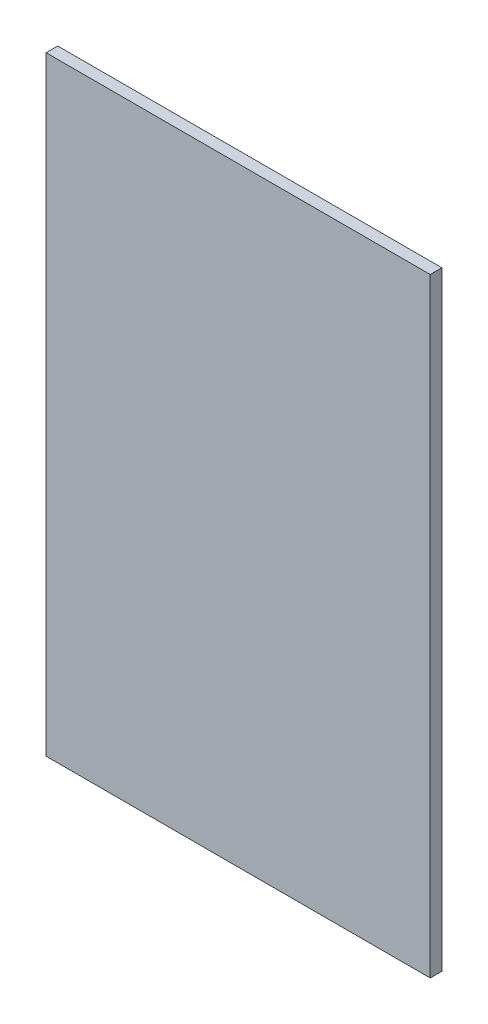
ISO-10303-21;
HEADER;
FILE_DESCRIPTION(('STEP AP214'),'2;1');
FILE_NAME('part.step','',(''),(''),'','','');
FILE_SCHEMA(('AUTOMOTIVE_DESIGN { 1 0 10303 214 1 1 1 1 }'));
ENDSEC;
DATA;
#1=APPLICATION_CONTEXT('core data for automotive mechanical design processes');
#2=APPLICATION_PROTOCOL_DEFINITION('international standard','automotive_design',2000,#1);
#3=PRODUCT_CONTEXT('',#1,'mechanical');
#4=PRODUCT('Part','Part','',(#3));
#5=PRODUCT_RELATED_PRODUCT_CATEGORY('part','',(#4));
#6=PRODUCT_DEFINITION_FORMATION('','',#4);
#7=PRODUCT_DEFINITION_CONTEXT('part definition',#1,'design');
#8=PRODUCT_DEFINITION('design','',#6,#7);
#9=PRODUCT_DEFINITION_SHAPE('','',#8);
#10=(LENGTH_UNIT() NAMED_UNIT(*) SI_UNIT(.MILLI.,.METRE.));
#11=(NAMED_UNIT(*) PLANE_ANGLE_UNIT() SI_UNIT($,.RADIAN.));
#12=(NAMED_UNIT(*) SI_UNIT($,.STERADIAN.) SOLID_ANGLE_UNIT());
#13=UNCERTAINTY_MEASURE_WITH_UNIT(LENGTH_MEASURE(1.E-05),#10,'distance_accuracy_value','');
#14=(GEOMETRIC_REPRESENTATION_CONTEXT(3) GLOBAL_UNCERTAINTY_ASSIGNED_CONTEXT((#13)) GLOBAL_UNIT_ASSIGNED_CONTEXT((#10,
#11,#12)) REPRESENTATION_CONTEXT('',''));
#15=CARTESIAN_POINT('',(0.,0.,0.));
#16=DIRECTION('',(0.,0.,1.));
#17=DIRECTION('',(1.,0.,0.));
#18=AXIS2_PLACEMENT_3D('',#15,#16,#17);
#19=CARTESIAN_POINT('',(0.,0.,22.));
#20=DIRECTION('',(1.,0.,0.));
#21=DIRECTION('',(0.,0.,-1.));
#22=AXIS2_PLACEMENT_3D('',#19,#20,#21);
#23=PLANE('',#22);
#24=DIRECTION('',(0.,-1.,0.));
#25=VECTOR('',#24,1.);
#26=CARTESIAN_POINT('',(0.,0.,0.));
#27=LINE('',#26,#25);
#28=CARTESIAN_POINT('',(0.,1150.,0.));
#29=VERTEX_POINT('',#28);
#30=CARTESIAN_POINT('',(0.,0.,0.));
#31=VERTEX_POINT('',#30);
#32=EDGE_CURVE('E95',#29,#31,#27,.T.);
#33=ORIENTED_EDGE('',*,*,#32,.T.);
#34=DIRECTION('',(0.,0.,-1.));
#35=VECTOR('',#34,1.);
#36=CARTESIAN_POINT('',(0.,0.,22.));
#37=LINE('',#36,#35);
#38=CARTESIAN_POINT('',(0.,0.,22.));
#39=VERTEX_POINT('',#38);
#40=EDGE_CURVE('E11',#39,#31,#37,.T.);
#41=ORIENTED_EDGE('',*,*,#40,.F.);
#42=DIRECTION('',(0.,-1.,0.));
#43=VECTOR('',#42,1.);
#44=CARTESIAN_POINT('',(0.,0.,22.));
#45=LINE('',#44,#43);
#46=CARTESIAN_POINT('',(0.,1150.,22.));
#47=VERTEX_POINT('',#46);
#48=EDGE_CURVE('E83',#47,#39,#45,.T.);
#49=ORIENTED_EDGE('',*,*,#48,.F.);
#50=DIRECTION('',(0.,0.,-1.));
#51=VECTOR('',#50,1.);
#52=CARTESIAN_POINT('',(0.,1150.,22.));
#53=LINE('',#52,#51);
#54=EDGE_CURVE('E91',#47,#29,#53,.T.);
#55=ORIENTED_EDGE('',*,*,#54,.T.);
#56=EDGE_LOOP('',(#33,#41,#49,#55));
#57=FACE_BOUND('',#56,.T.);
#58=ADVANCED_FACE('F32',(#57),#23,.F.);
#59=CARTESIAN_POINT('',(0.,0.,22.));
#60=DIRECTION('',(0.,1.,0.));
#61=DIRECTION('',(0.,0.,1.));
#62=AXIS2_PLACEMENT_3D('',#59,#60,#61);
#63=PLANE('',#62);
#64=DIRECTION('',(1.,0.,0.));
#65=VECTOR('',#64,1.);
#66=CARTESIAN_POINT('',(0.,0.,0.));
#67=LINE('',#66,#65);
#68=CARTESIAN_POINT('',(725.,0.,0.));
#69=VERTEX_POINT('',#68);
#70=EDGE_CURVE('E87',#31,#69,#67,.T.);
#71=ORIENTED_EDGE('',*,*,#70,.T.);
#72=DIRECTION('',(0.,0.,-1.));
#73=VECTOR('',#72,1.);
#74=CARTESIAN_POINT('',(725.,0.,22.));
#75=LINE('',#74,#73);
#76=CARTESIAN_POINT('',(725.,0.,22.));
#77=VERTEX_POINT('',#76);
#78=EDGE_CURVE('E40',#77,#69,#75,.T.);
#79=ORIENTED_EDGE('',*,*,#78,.F.);
#80=DIRECTION('',(1.,0.,0.));
#81=VECTOR('',#80,1.);
#82=CARTESIAN_POINT('',(0.,0.,22.));
#83=LINE('',#82,#81);
#84=EDGE_CURVE('E78',#39,#77,#83,.T.);
#85=ORIENTED_EDGE('',*,*,#84,.F.);
#86=ORIENTED_EDGE('',*,*,#40,.T.);
#87=EDGE_LOOP('',(#71,#79,#85,#86));
#88=FACE_BOUND('',#87,.T.);
#89=ADVANCED_FACE('F86',(#88),#63,.F.);
#90=CARTESIAN_POINT('',(725.,0.,22.));
#91=DIRECTION('',(-1.,0.,0.));
#92=DIRECTION('',(0.,0.,1.));
#93=AXIS2_PLACEMENT_3D('',#90,#91,#92);
#94=PLANE('',#93);
#95=DIRECTION('',(0.,1.,0.));
#96=VECTOR('',#95,1.);
#97=CARTESIAN_POINT('',(725.,0.,0.));
#98=LINE('',#97,#96);
#99=CARTESIAN_POINT('',(725.,1150.,0.));
#100=VERTEX_POINT('',#99);
#101=EDGE_CURVE('E65',#69,#100,#98,.T.);
#102=ORIENTED_EDGE('',*,*,#101,.T.);
#103=DIRECTION('',(0.,0.,-1.));
#104=VECTOR('',#103,1.);
#105=CARTESIAN_POINT('',(725.,1150.,22.));
#106=LINE('',#105,#104);
#107=CARTESIAN_POINT('',(725.,1150.,22.));
#108=VERTEX_POINT('',#107);
#109=EDGE_CURVE('E88',#108,#100,#106,.T.);
#110=ORIENTED_EDGE('',*,*,#109,.F.);
#111=DIRECTION('',(0.,1.,0.));
#112=VECTOR('',#111,1.);
#113=CARTESIAN_POINT('',(725.,0.,22.));
#114=LINE('',#113,#112);
#115=EDGE_CURVE('E81',#77,#108,#114,.T.);
#116=ORIENTED_EDGE('',*,*,#115,.F.);
#117=ORIENTED_EDGE('',*,*,#78,.T.);
#118=EDGE_LOOP('',(#102,#110,#116,#117));
#119=FACE_BOUND('',#118,.T.);
#120=ADVANCED_FACE('F89',(#119),#94,.F.);
#121=CARTESIAN_POINT('',(0.,1150.,22.));
#122=DIRECTION('',(0.,-1.,0.));
#123=DIRECTION('',(0.,0.,-1.));
#124=AXIS2_PLACEMENT_3D('',#121,#122,#123);
#125=PLANE('',#124);
#126=DIRECTION('',(-1.,0.,0.));
#127=VECTOR('',#126,1.);
#128=CARTESIAN_POINT('',(0.,1150.,0.));
#129=LINE('',#128,#127);
#130=EDGE_CURVE('E71',#100,#29,#129,.T.);
#131=ORIENTED_EDGE('',*,*,#130,.T.);
#132=ORIENTED_EDGE('',*,*,#54,.F.);
#133=DIRECTION('',(-1.,0.,0.));
#134=VECTOR('',#133,1.);
#135=CARTESIAN_POINT('',(0.,1150.,22.));
#136=LINE('',#135,#134);
#137=EDGE_CURVE('E48',#108,#47,#136,.T.);
#138=ORIENTED_EDGE('',*,*,#137,.F.);
#139=ORIENTED_EDGE('',*,*,#109,.T.);
#140=EDGE_LOOP('',(#131,#132,#138,#139));
#141=FACE_BOUND('',#140,.T.);
#142=ADVANCED_FACE('F102',(#141),#125,.F.);
#143=CARTESIAN_POINT('',(0.,0.,22.));
#144=DIRECTION('',(0.,0.,-1.));
#145=DIRECTION('',(-1.,0.,0.));
#146=AXIS2_PLACEMENT_3D('',#143,#144,#145);
#147=PLANE('',#146);
#148=ORIENTED_EDGE('',*,*,#48,.T.);
#149=ORIENTED_EDGE('',*,*,#84,.T.);
#150=ORIENTED_EDGE('',*,*,#115,.T.);
#151=ORIENTED_EDGE('',*,*,#137,.T.);
#152=EDGE_LOOP('',(#148,#149,#150,#151));
#153=FACE_BOUND('',#152,.T.);
#154=ADVANCED_FACE('F79',(#153),#147,.F.);
#155=CARTESIAN_POINT('',(0.,0.,0.));
#156=DIRECTION('',(0.,0.,-1.));
#157=DIRECTION('',(-1.,0.,0.));
#158=AXIS2_PLACEMENT_3D('',#155,#156,#157);
#159=PLANE('',#158);
#160=ORIENTED_EDGE('',*,*,#32,.F.);
#161=ORIENTED_EDGE('',*,*,#130,.F.);
#162=ORIENTED_EDGE('',*,*,#101,.F.);
#163=ORIENTED_EDGE('',*,*,#70,.F.);
#164=EDGE_LOOP('',(#160,#161,#162,#163));
#165=FACE_BOUND('',#164,.T.);
#166=ADVANCED_FACE('F105',(#165),#159,.T.);
#167=CLOSED_SHELL('',(#58,#89,#120,#142,#154,#166));
#168=MANIFOLD_SOLID_BREP('B2',#167);
#169=ADVANCED_BREP_SHAPE_REPRESENTATION('',(#18,#168),#14);
#170=SHAPE_DEFINITION_REPRESENTATION(#9,#169);
ENDSEC;
END-ISO-10303-21;
